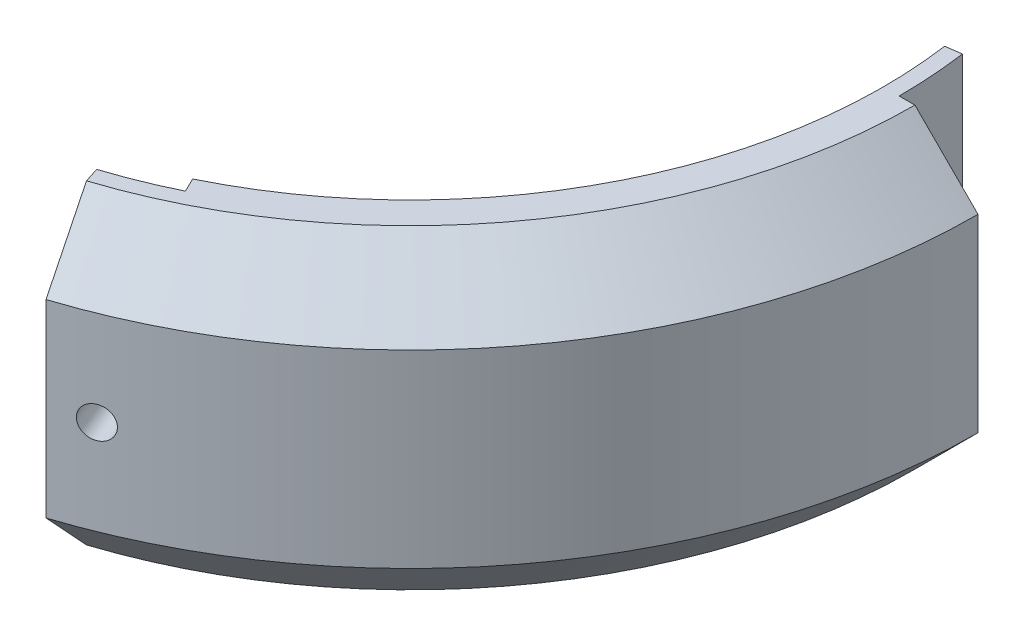
ISO-10303-21;
HEADER;
FILE_DESCRIPTION(('STEP AP214'),'2;1');
FILE_NAME('part.step','',(''),(''),'','','');
FILE_SCHEMA(('AUTOMOTIVE_DESIGN { 1 0 10303 214 1 1 1 1 }'));
ENDSEC;
DATA;
#1=APPLICATION_CONTEXT('core data for automotive mechanical design processes');
#2=APPLICATION_PROTOCOL_DEFINITION('international standard','automotive_design',2000,#1);
#3=PRODUCT_CONTEXT('',#1,'mechanical');
#4=PRODUCT('Part','Part','',(#3));
#5=PRODUCT_RELATED_PRODUCT_CATEGORY('part','',(#4));
#6=PRODUCT_DEFINITION_FORMATION('','',#4);
#7=PRODUCT_DEFINITION_CONTEXT('part definition',#1,'design');
#8=PRODUCT_DEFINITION('design','',#6,#7);
#9=PRODUCT_DEFINITION_SHAPE('','',#8);
#10=(LENGTH_UNIT() NAMED_UNIT(*) SI_UNIT(.MILLI.,.METRE.));
#11=(NAMED_UNIT(*) PLANE_ANGLE_UNIT() SI_UNIT($,.RADIAN.));
#12=(NAMED_UNIT(*) SI_UNIT($,.STERADIAN.) SOLID_ANGLE_UNIT());
#13=UNCERTAINTY_MEASURE_WITH_UNIT(LENGTH_MEASURE(1.E-05),#10,'distance_accuracy_value','');
#14=(GEOMETRIC_REPRESENTATION_CONTEXT(3) GLOBAL_UNCERTAINTY_ASSIGNED_CONTEXT((#13)) GLOBAL_UNIT_ASSIGNED_CONTEXT((#10,
#11,#12)) REPRESENTATION_CONTEXT('',''));
#15=CARTESIAN_POINT('',(0.,0.,0.));
#16=DIRECTION('',(0.,0.,1.));
#17=DIRECTION('',(1.,0.,0.));
#18=AXIS2_PLACEMENT_3D('',#15,#16,#17);
#19=CARTESIAN_POINT('',(0.,54.0309861928928,0.));
#20=DIRECTION('',(0.,1.,0.));
#21=DIRECTION('',(0.,0.,1.));
#22=AXIS2_PLACEMENT_3D('',#19,#20,#21);
#23=CYLINDRICAL_SURFACE('',#22,70.);
#24=DIRECTION('',(0.,1.,0.));
#25=VECTOR('',#24,1.);
#26=CARTESIAN_POINT('',(30.6859802752353,-25.,62.9155832409418));
#27=LINE('',#26,#25);
#28=CARTESIAN_POINT('',(30.6859802752353,-7.5,62.9155832409418));
#29=VERTEX_POINT('',#28);
#30=CARTESIAN_POINT('',(30.6859802752353,7.5,62.9155832409418));
#31=VERTEX_POINT('',#30);
#32=EDGE_CURVE('E168',#29,#31,#27,.T.);
#33=ORIENTED_EDGE('',*,*,#32,.T.);
#34=CARTESIAN_POINT('',(0.,7.5,0.));
#35=DIRECTION('',(0.,1.,0.));
#36=DIRECTION('',(0.,0.,1.));
#37=AXIS2_PLACEMENT_3D('',#34,#35,#36);
#38=CIRCLE('',#37,70.);
#39=CARTESIAN_POINT('',(69.3187648119099,7.5,-9.7421170672046));
#40=VERTEX_POINT('',#39);
#41=EDGE_CURVE('E275',#31,#40,#38,.T.);
#42=ORIENTED_EDGE('',*,*,#41,.T.);
#43=DIRECTION('',(0.,-1.,0.));
#44=VECTOR('',#43,1.);
#45=CARTESIAN_POINT('',(69.3187648119099,7.5,-9.7421170672046));
#46=LINE('',#45,#44);
#47=CARTESIAN_POINT('',(69.3187648119099,-7.5,-9.7421170672046));
#48=VERTEX_POINT('',#47);
#49=EDGE_CURVE('E233',#40,#48,#46,.T.);
#50=ORIENTED_EDGE('',*,*,#49,.T.);
#51=CARTESIAN_POINT('',(0.,-7.5,0.));
#52=DIRECTION('',(0.,1.,0.));
#53=DIRECTION('',(0.,0.,1.));
#54=AXIS2_PLACEMENT_3D('',#51,#52,#53);
#55=CIRCLE('',#54,70.);
#56=EDGE_CURVE('E278',#29,#48,#55,.T.);
#57=ORIENTED_EDGE('',*,*,#56,.F.);
#58=EDGE_LOOP('',(#33,#42,#50,#57));
#59=FACE_BOUND('',#58,.T.);
#60=CARTESIAN_POINT('',(69.9593263831697,0.,-2.38592791448767));
#61=CARTESIAN_POINT('',(69.959326550426,0.140378044259406,-2.38593415177356));
#62=CARTESIAN_POINT('',(69.9589248819653,0.280856736087863,-2.39779209793044));
#63=CARTESIAN_POINT('',(69.9572931642084,0.557941966835482,-2.44492695153471));
#64=CARTESIAN_POINT('',(69.9560621285396,0.694543693020799,-2.48023174378259));
#65=CARTESIAN_POINT('',(69.9527023788442,0.959820836298902,-2.57324369685586));
#66=CARTESIAN_POINT('',(69.9505741082575,1.08850013293342,-2.63093979012618));
#67=CARTESIAN_POINT('',(69.9453211083535,1.33430989113533,-2.76706924621994));
#68=CARTESIAN_POINT('',(69.9421966203571,1.45144314059838,-2.84549758613608));
#69=CARTESIAN_POINT('',(69.9348398411618,1.67094031065622,-3.02090426863462));
#70=CARTESIAN_POINT('',(69.9306069933707,1.77329677051745,-3.11789192466232));
#71=CARTESIAN_POINT('',(69.920940093781,1.96027173551395,-3.32763189793));
#72=CARTESIAN_POINT('',(69.9155059938863,2.04488953015974,-3.44038484631823));
#73=CARTESIAN_POINT('',(69.9033835326936,2.19400040929476,-3.67847261426926));
#74=CARTESIAN_POINT('',(69.8966948597617,2.25848848296921,-3.80381055632076));
#75=CARTESIAN_POINT('',(69.8820796457553,2.36547693738323,-4.06347599876575));
#76=CARTESIAN_POINT('',(69.8741531106762,2.40797742461368,-4.19780345561742));
#77=CARTESIAN_POINT('',(69.857167821694,2.46976676296927,-4.47156506274886));
#78=CARTESIAN_POINT('',(69.8481095564155,2.4890655934421,-4.61099699091565));
#79=CARTESIAN_POINT('',(69.8290574350643,2.50393455933073,-4.89105653631662));
#80=CARTESIAN_POINT('',(69.8190635835768,2.49950481103373,-5.03168414768771));
#81=CARTESIAN_POINT('',(69.7984424199141,2.46705073334547,-5.310076696771));
#82=CARTESIAN_POINT('',(69.7878153986748,2.43903716399264,-5.44784291061948));
#83=CARTESIAN_POINT('',(69.7663085533228,2.36022730355139,-5.71667624574899));
#84=CARTESIAN_POINT('',(69.7554287285355,2.3094309516504,-5.84774334914749));
#85=CARTESIAN_POINT('',(69.7338659000933,2.18648512043652,-6.09950252666526));
#86=CARTESIAN_POINT('',(69.7231829424338,2.11433071664268,-6.22019219979154));
#87=CARTESIAN_POINT('',(69.7025071210962,1.95072061799124,-6.44775752850294));
#88=CARTESIAN_POINT('',(69.6925142597695,1.85926485737246,-6.55463313702049));
#89=CARTESIAN_POINT('',(69.6737075923947,1.65958725365567,-6.75161376746318));
#90=CARTESIAN_POINT('',(69.6648944479481,1.55135607547707,-6.84170938993159));
#91=CARTESIAN_POINT('',(69.6489148103262,1.32123281660857,-7.00251503648843));
#92=CARTESIAN_POINT('',(69.6417483174533,1.19934073340952,-7.07322505701623));
#93=CARTESIAN_POINT('',(69.6294521482925,0.945350345305501,-7.19326437909211));
#94=CARTESIAN_POINT('',(69.6243225020767,0.813251889747584,-7.24259336497061));
#95=CARTESIAN_POINT('',(69.6163874695355,0.542600994389155,-7.31847413125912));
#96=CARTESIAN_POINT('',(69.6135820742646,0.404048579430221,-7.34502599933164));
#97=CARTESIAN_POINT('',(69.6104561531306,0.124504771162317,-7.37459286976123));
#98=CARTESIAN_POINT('',(69.6101342552323,-0.0164852323158466,-7.37762086814308));
#99=CARTESIAN_POINT('',(69.6119901379051,-0.296974054397864,-7.36008857032014));
#100=CARTESIAN_POINT('',(69.6141679143215,-0.43647287547979,-7.33952831332088));
#101=CARTESIAN_POINT('',(69.6208980391033,-0.709982966958439,-7.27540955692346));
#102=CARTESIAN_POINT('',(69.6254497765374,-0.843995639632643,-7.23185697449026));
#103=CARTESIAN_POINT('',(69.6366716125029,-1.10277239088705,-7.12298702499493));
#104=CARTESIAN_POINT('',(69.6433417171815,-1.22753644262814,-7.05766959477513));
#105=CARTESIAN_POINT('',(69.6584379453965,-1.46433449479363,-6.90707826619894));
#106=CARTESIAN_POINT('',(69.6668648394314,-1.57636287613935,-6.82179560940295));
#107=CARTESIAN_POINT('',(69.6850272353327,-1.78445304917113,-6.63369305505199));
#108=CARTESIAN_POINT('',(69.6947627417154,-1.88051478574829,-6.53087309696946));
#109=CARTESIAN_POINT('',(69.7150576027051,-2.05398848521842,-6.3105439400178));
#110=CARTESIAN_POINT('',(69.7256173266289,-2.13139202346875,-6.19302814184566));
#111=CARTESIAN_POINT('',(69.747060651571,-2.26529453507196,-5.94666285900773));
#112=CARTESIAN_POINT('',(69.757944251699,-2.32179356588254,-5.81781340549459));
#113=CARTESIAN_POINT('',(69.7795665003215,-2.41226848815667,-5.55245893679651));
#114=CARTESIAN_POINT('',(69.7903051832206,-2.44624982107733,-5.41595577980197));
#115=CARTESIAN_POINT('',(69.8112350801234,-2.49074257909727,-5.13913569790411));
#116=CARTESIAN_POINT('',(69.8214262952185,-2.50125405098419,-4.99881878060416));
#117=CARTESIAN_POINT('',(69.8409342845849,-2.4985080934889,-4.71843583591915));
#118=CARTESIAN_POINT('',(69.8502515433931,-2.48526391760666,-4.57836971225207));
#119=CARTESIAN_POINT('',(69.8677935631109,-2.43540992027922,-4.30238879239136));
#120=CARTESIAN_POINT('',(69.8760183218775,-2.39880005300248,-4.16647400434108));
#121=CARTESIAN_POINT('',(69.8912493792916,-2.30325608756317,-3.9026572593203));
#122=CARTESIAN_POINT('',(69.898255659435,-2.24432165041887,-3.7747554240548));
#123=CARTESIAN_POINT('',(69.9110132967545,-2.10580501261109,-3.53060657553858));
#124=CARTESIAN_POINT('',(69.9167646976851,-2.02622353207188,-3.41435915600303));
#125=CARTESIAN_POINT('',(69.9270516694599,-1.84862892844088,-3.19676963532564));
#126=CARTESIAN_POINT('',(69.931586690873,-1.75060751004133,-3.09543427916572));
#127=CARTESIAN_POINT('',(69.9395240428742,-1.53890331572833,-2.91059453549716));
#128=CARTESIAN_POINT('',(69.942926093141,-1.42521667372808,-2.82709456267103));
#129=CARTESIAN_POINT('',(69.9487059436541,-1.18535423338409,-2.68029012617918));
#130=CARTESIAN_POINT('',(69.9510830039567,-1.05916949316,-2.61700026077957));
#131=CARTESIAN_POINT('',(69.9549123252303,-0.798052647910152,-2.51256804944793));
#132=CARTESIAN_POINT('',(69.9563656869298,-0.663131166213629,-2.47139935183717));
#133=CARTESIAN_POINT('',(69.958045135244,-0.4394672014826,-2.42327070403676));
#134=CARTESIAN_POINT('',(69.9585265338674,-0.352175793305513,-2.40928494607034));
#135=CARTESIAN_POINT('',(69.9591671051461,-0.176602870327788,-2.39061159111026));
#136=CARTESIAN_POINT('',(69.9593262779375,-0.0883213559455261,-2.38592399018776));
#137=CARTESIAN_POINT('',(69.9593263831697,0.,-2.38592791448767));
#138=B_SPLINE_CURVE_WITH_KNOTS('',3,(#60,#61,#62,#63,#64,#65,#66,#67,#68,#69,#70,#71,#72,#73,
#74,#75,#76,#77,#78,#79,#80,#81,#82,#83,#84,#85,#86,#87,#88,#89,#90,#91,#92,#93,#94,#95,#96,#97,
#98,#99,#100,#101,#102,#103,#104,#105,#106,#107,#108,#109,#110,#111,#112,#113,#114,#115,#116,
#117,#118,#119,#120,#121,#122,#123,#124,#125,#126,#127,#128,#129,#130,#131,#132,#133,#134,#135,
#136,#137),.UNSPECIFIED.,.T.,.F.,(4,2,2,2,2,2,2,2,2,2,2,2,2,2,2,2,2,2,2,2,2,2,2,2,2,2,2,2,2,2,2,
2,2,2,2,2,2,2,4),(0.,0.420811743080999,0.842124846338541,1.26322996796266,1.68423315965435,
2.10544817605607,2.5266800602253,2.94801671657856,3.36935133228352,3.79050466133906,
4.2116559264407,4.63261514677333,5.05357549075088,5.47463297036998,5.89569188458703,
6.31698595390646,6.73828010060707,7.15958046708274,7.58087921208849,8.0019451893299,
8.42301046672782,8.84396743777483,9.2649256303738,9.68606883808779,10.1072134993481,
10.5285479632374,10.9498812690468,11.3711127214597,11.7923433341384,12.2133390113783,
12.6343355143989,13.0553384101899,13.4763266242829,13.8975046770929,14.3187868610091,
14.7403726628308,15.1614551339686,15.4262164764366,15.6909777070321),.UNSPECIFIED.);
#139=CARTESIAN_POINT('',(69.9593263831697,0.,-2.38592791448767));
#140=VERTEX_POINT('',#139);
#141=EDGE_CURVE('E310',#140,#140,#138,.T.);
#142=ORIENTED_EDGE('',*,*,#141,.F.);
#143=EDGE_LOOP('',(#142));
#144=FACE_BOUND('',#143,.T.);
#145=ADVANCED_FACE('F40',(#59,#144),#23,.F.);
#146=CARTESIAN_POINT('',(0.,-25.,0.));
#147=DIRECTION('',(0.,1.,0.));
#148=DIRECTION('',(0.,0.,1.));
#149=AXIS2_PLACEMENT_3D('',#146,#147,#148);
#150=CYLINDRICAL_SURFACE('',#149,77.5);
#151=DIRECTION('',(0.,1.,0.));
#152=VECTOR('',#151,1.);
#153=CARTESIAN_POINT('',(77.5,-25.,0.));
#154=LINE('',#153,#152);
#155=CARTESIAN_POINT('',(77.5,-25.,0.));
#156=VERTEX_POINT('',#155);
#157=CARTESIAN_POINT('',(77.5,25.,0.));
#158=VERTEX_POINT('',#157);
#159=EDGE_CURVE('E148',#156,#158,#154,.T.);
#160=ORIENTED_EDGE('',*,*,#159,.F.);
#161=CARTESIAN_POINT('',(0.,-25.,0.));
#162=DIRECTION('',(0.,1.,0.));
#163=DIRECTION('',(0.,0.,1.));
#164=AXIS2_PLACEMENT_3D('',#161,#162,#163);
#165=CIRCLE('',#164,77.5);
#166=CARTESIAN_POINT('',(76.7457753274717,-25.,-10.7859153244051));
#167=VERTEX_POINT('',#166);
#168=EDGE_CURVE('E71',#156,#167,#165,.T.);
#169=ORIENTED_EDGE('',*,*,#168,.T.);
#170=DIRECTION('',(0.,1.,0.));
#171=VECTOR('',#170,1.);
#172=CARTESIAN_POINT('',(76.7457753274717,-25.,-10.7859153244051));
#173=LINE('',#172,#171);
#174=CARTESIAN_POINT('',(76.7457753274717,25.,-10.7859153244051));
#175=VERTEX_POINT('',#174);
#176=EDGE_CURVE('E163',#167,#175,#173,.T.);
#177=ORIENTED_EDGE('',*,*,#176,.T.);
#178=CARTESIAN_POINT('',(0.,25.,0.));
#179=DIRECTION('',(0.,1.,0.));
#180=DIRECTION('',(0.,0.,1.));
#181=AXIS2_PLACEMENT_3D('',#178,#179,#180);
#182=CIRCLE('',#181,77.5);
#183=EDGE_CURVE('E160',#158,#175,#182,.T.);
#184=ORIENTED_EDGE('',*,*,#183,.F.);
#185=EDGE_LOOP('',(#160,#169,#177,#184));
#186=FACE_BOUND('',#185,.T.);
#187=CARTESIAN_POINT('',(77.4453702529907,0.,-2.90940309637351));
#188=CARTESIAN_POINT('',(77.44537036223,0.140386896102214,-2.90940933276516));
#189=CARTESIAN_POINT('',(77.4449274208994,0.280874656140934,-2.921265885909));
#190=CARTESIAN_POINT('',(77.4431350164643,0.557978380898638,-2.96839577972018));
#191=CARTESIAN_POINT('',(77.4417844717835,0.69458952324232,-3.00369705849955));
#192=CARTESIAN_POINT('',(77.4381210636492,0.959885547095167,-3.09670139955933));
#193=CARTESIAN_POINT('',(77.4358086726694,1.08857428462997,-3.15439346221393));
#194=CARTESIAN_POINT('',(77.4301435100699,1.33440105343723,-3.29051573396913));
#195=CARTESIAN_POINT('',(77.4267909916464,1.45154188665813,-3.36894089536632));
#196=CARTESIAN_POINT('',(77.4189599763052,1.67104275219641,-3.5443367030454));
#197=CARTESIAN_POINT('',(77.414480996137,1.77339641108803,-3.64131530444561));
#198=CARTESIAN_POINT('',(77.4043313354422,1.96036374200774,-3.85103734720959));
#199=CARTESIAN_POINT('',(77.3986606073736,2.04497670604119,-3.9637814174416));
#200=CARTESIAN_POINT('',(77.3861013159498,2.19407206410734,-4.20184631911576));
#201=CARTESIAN_POINT('',(77.3792125099455,2.25855044010771,-4.3271696542744));
#202=CARTESIAN_POINT('',(77.3642559305798,2.36552023855836,-4.58680673116331));
#203=CARTESIAN_POINT('',(77.3561881623129,2.40801175601615,-4.72112043404244));
#204=CARTESIAN_POINT('',(77.3389945998533,2.46978742155111,-4.99486794540066));
#205=CARTESIAN_POINT('',(77.3298691777333,2.48907970389647,-5.13429994158872));
#206=CARTESIAN_POINT('',(77.3107648442457,2.50393432807648,-5.41436392074262));
#207=CARTESIAN_POINT('',(77.3007859365743,2.49949677267251,-5.55499589850934));
#208=CARTESIAN_POINT('',(77.2802741145048,2.46702453766643,-5.83341371315848));
#209=CARTESIAN_POINT('',(77.2697414075528,2.43899863574046,-5.97120058922001));
#210=CARTESIAN_POINT('',(77.2484927088292,2.36015884258222,-6.2400780316841));
#211=CARTESIAN_POINT('',(77.2377767166226,2.30934489724892,-6.37116858218811));
#212=CARTESIAN_POINT('',(77.2165931718771,2.18636137736616,-6.62296941747174));
#213=CARTESIAN_POINT('',(77.20612566651,2.11418778245581,-6.7436777425605));
#214=CARTESIAN_POINT('',(77.1859077597756,1.95053669217787,-6.97127812710442));
#215=CARTESIAN_POINT('',(77.1761573603484,1.85905914458625,-7.07817014918033));
#216=CARTESIAN_POINT('',(77.1578365778376,1.65934718273147,-7.2751679681983));
#217=CARTESIAN_POINT('',(77.1492667344506,1.55110515222581,-7.36526609433621));
#218=CARTESIAN_POINT('',(77.1337460153238,1.32096367835869,-7.52607289424791));
#219=CARTESIAN_POINT('',(77.1267951398616,1.19906423265587,-7.59678156469766));
#220=CARTESIAN_POINT('',(77.1148782620334,0.945063867272257,-7.71681325113766));
#221=CARTESIAN_POINT('',(77.1099122830324,0.812962827525994,-7.76613601538588));
#222=CARTESIAN_POINT('',(77.10223411798,0.542311126138941,-7.84199976122125));
#223=CARTESIAN_POINT('',(77.0995219248371,0.403760484793119,-7.86854081449054));
#224=CARTESIAN_POINT('',(77.0965012466364,0.124209449797037,-7.89808336755831));
#225=CARTESIAN_POINT('',(77.0961916786359,-0.0167898114534679,-7.90109547263539));
#226=CARTESIAN_POINT('',(77.0979905219835,-0.297294382195192,-7.88352284751544));
#227=CARTESIAN_POINT('',(77.1000989300741,-0.436799693698759,-7.86293814910731));
#228=CARTESIAN_POINT('',(77.1066168012898,-0.71032655493914,-7.79876109940765));
#229=CARTESIAN_POINT('',(77.1110257820297,-0.844349247923779,-7.7551735713402));
#230=CARTESIAN_POINT('',(77.1219049435849,-1.10314155598354,-7.6462250603809));
#231=CARTESIAN_POINT('',(77.1283751292345,-1.22791114935586,-7.58086402642208));
#232=CARTESIAN_POINT('',(77.1430363353185,-1.46470456807067,-7.43018539457835));
#233=CARTESIAN_POINT('',(77.1512279720901,-1.57672380615384,-7.34486064777143));
#234=CARTESIAN_POINT('',(77.1689116435078,-1.78479060926658,-7.15667406543826));
#235=CARTESIAN_POINT('',(77.1784036819107,-1.88083812815463,-7.05381217924983));
#236=CARTESIAN_POINT('',(77.1982299061547,-2.05427062638837,-6.83341223748384));
#237=CARTESIAN_POINT('',(77.2085644002299,-2.13164873367917,-6.71586880183872));
#238=CARTESIAN_POINT('',(77.2296017863641,-2.26549893959274,-6.469457319605));
#239=CARTESIAN_POINT('',(77.2403046775247,-2.32197108919414,-6.34058930063207));
#240=CARTESIAN_POINT('',(77.261630945429,-2.41239429180301,-6.07520260996008));
#241=CARTESIAN_POINT('',(77.2722543374646,-2.44634979207087,-5.93868545482101));
#242=CARTESIAN_POINT('',(77.2930316152259,-2.49079040673497,-5.66184808307405));
#243=CARTESIAN_POINT('',(77.3031855015593,-2.50127555150331,-5.52152787138779));
#244=CARTESIAN_POINT('',(77.3227020745872,-2.49847731385191,-5.24113403412554));
#245=CARTESIAN_POINT('',(77.3320651194508,-2.48520475231093,-5.10106032536079));
#246=CARTESIAN_POINT('',(77.3497756153684,-2.43529012993247,-4.82507421376923));
#247=CARTESIAN_POINT('',(77.3581230644186,-2.39864802298612,-4.68916181915338));
#248=CARTESIAN_POINT('',(77.3736626272502,-2.30303606711253,-4.42535937880162));
#249=CARTESIAN_POINT('',(77.3808547223344,-2.24406585689997,-4.29746946291442));
#250=CARTESIAN_POINT('',(77.394026143599,-2.10547499331861,-4.05335402614142));
#251=CARTESIAN_POINT('',(77.4000055130403,-2.02585507680481,-3.93712808924856));
#252=CARTESIAN_POINT('',(77.4107644171025,-1.84819163739616,-3.71960186903178));
#253=CARTESIAN_POINT('',(77.4155435325342,-1.75014169865189,-3.61830680541127));
#254=CARTESIAN_POINT('',(77.4239581696927,-1.53838468568991,-3.43355200066631));
#255=CARTESIAN_POINT('',(77.4275934081165,-1.42467374273518,-3.35009667953323));
#256=CARTESIAN_POINT('',(77.4338022113701,-1.18477414046503,-3.20338688357239));
#257=CARTESIAN_POINT('',(77.4363750574282,-1.05857710488655,-3.14014609159372));
#258=CARTESIAN_POINT('',(77.4405360010762,-0.797443607595875,-3.03580898239044));
#259=CARTESIAN_POINT('',(77.442125272319,-0.662517774815167,-2.9946862804102));
#260=CARTESIAN_POINT('',(77.4439641325333,-0.438950707462365,-2.94664856824325));
#261=CARTESIAN_POINT('',(77.4444921453646,-0.351760348294769,-2.93269920983707));
#262=CARTESIAN_POINT('',(77.4451951712108,-0.176393268354732,-2.91407451607319));
#263=CARTESIAN_POINT('',(77.4453701843467,-0.0882165479200912,-2.90939917753951));
#264=CARTESIAN_POINT('',(77.4453702529907,0.,-2.90940309637351));
#265=B_SPLINE_CURVE_WITH_KNOTS('',3,(#187,#188,#189,#190,#191,#192,#193,#194,#195,#196,#197,
#198,#199,#200,#201,#202,#203,#204,#205,#206,#207,#208,#209,#210,#211,#212,#213,#214,#215,#216,
#217,#218,#219,#220,#221,#222,#223,#224,#225,#226,#227,#228,#229,#230,#231,#232,#233,#234,#235,
#236,#237,#238,#239,#240,#241,#242,#243,#244,#245,#246,#247,#248,#249,#250,#251,#252,#253,#254,
#255,#256,#257,#258,#259,#260,#261,#262,#263,#264),.UNSPECIFIED.,.T.,.F.,(4,2,2,2,2,2,2,2,2,2,2,
2,2,2,2,2,2,2,2,2,2,2,2,2,2,2,2,2,2,2,2,2,2,2,2,2,2,2,4),(0.,0.420838684383421,
0.842179766861852,1.26331412411443,1.68434604579612,2.10555889865818,2.52678855806067,
2.94810222386862,3.36941406912099,3.79057814813368,4.21174040330895,4.63274600518691,
5.05375260657846,5.47483850122474,5.89592553507224,6.31720443643065,6.73848341001129,
7.15976734250004,7.58104994942379,8.00214265931849,8.4232348019305,8.84423868517168,
9.26524355583061,9.68639941793551,10.1075564967178,10.5288683642108,10.9501792043391,
11.3714068066153,11.7926338637964,12.2136691142809,12.634705195484,13.0557480896555,
13.4767759615847,13.8979506738743,14.3192296161696,14.7407931136576,15.1618526047454,
15.4262999977151,15.6907473001222),.UNSPECIFIED.);
#266=CARTESIAN_POINT('',(77.4453702529907,0.,-2.90940309637351));
#267=VERTEX_POINT('',#266);
#268=EDGE_CURVE('E44',#267,#267,#265,.T.);
#269=ORIENTED_EDGE('',*,*,#268,.T.);
#270=EDGE_LOOP('',(#269));
#271=FACE_BOUND('',#270,.T.);
#272=ADVANCED_FACE('F161',(#186,#271),#150,.T.);
#273=CARTESIAN_POINT('',(0.,54.0309861928928,0.));
#274=DIRECTION('',(0.,1.,0.));
#275=DIRECTION('',(0.,0.,1.));
#276=AXIS2_PLACEMENT_3D('',#273,#274,#275);
#277=CYLINDRICAL_SURFACE('',#276,90.);
#278=CARTESIAN_POINT('',(0.,-15.,0.));
#279=DIRECTION('',(0.,1.,0.));
#280=DIRECTION('',(0.,0.,1.));
#281=AXIS2_PLACEMENT_3D('',#278,#279,#280);
#282=CIRCLE('',#281,90.);
#283=CARTESIAN_POINT('',(27.811529493745,-15.,85.5950864665639));
#284=VERTEX_POINT('',#283);
#285=CARTESIAN_POINT('',(90.,-15.,0.));
#286=VERTEX_POINT('',#285);
#287=EDGE_CURVE('E291',#284,#286,#282,.T.);
#288=ORIENTED_EDGE('',*,*,#287,.T.);
#289=DIRECTION('',(0.,1.,0.));
#290=VECTOR('',#289,1.);
#291=CARTESIAN_POINT('',(90.,-25.,0.));
#292=LINE('',#291,#290);
#293=CARTESIAN_POINT('',(90.,15.,0.));
#294=VERTEX_POINT('',#293);
#295=EDGE_CURVE('E157',#286,#294,#292,.T.);
#296=ORIENTED_EDGE('',*,*,#295,.T.);
#297=CARTESIAN_POINT('',(0.,15.,0.));
#298=DIRECTION('',(0.,1.,0.));
#299=DIRECTION('',(0.,0.,1.));
#300=AXIS2_PLACEMENT_3D('',#297,#298,#299);
#301=CIRCLE('',#300,90.);
#302=CARTESIAN_POINT('',(27.811529493745,15.,85.5950864665639));
#303=VERTEX_POINT('',#302);
#304=EDGE_CURVE('E295',#303,#294,#301,.T.);
#305=ORIENTED_EDGE('',*,*,#304,.F.);
#306=DIRECTION('',(0.,1.,0.));
#307=VECTOR('',#306,1.);
#308=CARTESIAN_POINT('',(27.811529493745,15.,85.5950864665639));
#309=LINE('',#308,#307);
#310=EDGE_CURVE('E263',#284,#303,#309,.T.);
#311=ORIENTED_EDGE('',*,*,#310,.F.);
#312=EDGE_LOOP('',(#288,#296,#305,#311));
#313=FACE_BOUND('',#312,.T.);
#314=CARTESIAN_POINT('',(31.3836240875641,0.,84.3508632980746));
#315=CARTESIAN_POINT('',(31.3836300276001,-0.140397030234249,84.3508614037102));
#316=CARTESIAN_POINT('',(31.3947509435403,-0.280895172113522,84.3467260231215));
#317=CARTESIAN_POINT('',(31.4389488877238,-0.558020069884317,84.3302616356892));
#318=CARTESIAN_POINT('',(31.472052171378,-0.694641992361816,84.3179228307774));
#319=CARTESIAN_POINT('',(31.5592395547899,-0.959959631646382,84.2853282154057));
#320=CARTESIAN_POINT('',(31.6133134251579,-1.08865917755253,84.2650762649184));
#321=CARTESIAN_POINT('',(31.7408457477325,-1.33450542026713,84.2171201699266));
#322=CARTESIAN_POINT('',(31.8142994553633,-1.45165493512669,84.1894178493911));
#323=CARTESIAN_POINT('',(31.9784843588244,-1.6711600281202,84.1271907583789));
#324=CARTESIAN_POINT('',(32.0692215185269,-1.77351047814285,84.0926636327619));
#325=CARTESIAN_POINT('',(32.265324938644,-1.9604690650959,84.0176160415272));
#326=CARTESIAN_POINT('',(32.370691780198,-2.04507649687948,83.9770953378206));
#327=CARTESIAN_POINT('',(32.593019735959,-2.19415408514549,83.8910558584073));
#328=CARTESIAN_POINT('',(32.7099825062234,-2.25862135986432,83.8455363687052));
#329=CARTESIAN_POINT('',(32.9521192093744,-2.36556980234931,83.7506700271869));
#330=CARTESIAN_POINT('',(33.0772931116844,-2.40805105198163,83.7013231896228));
#331=CARTESIAN_POINT('',(33.3322285665309,-2.46981106609731,83.6001275825603));
#332=CARTESIAN_POINT('',(33.4619889195456,-2.48909585174001,83.5482794659607));
#333=CARTESIAN_POINT('',(33.7224255352597,-2.50393405465755,83.4435001352073));
#334=CARTESIAN_POINT('',(33.8531017945893,-2.49948755919938,83.3905689250371));
#335=CARTESIAN_POINT('',(34.1116269604994,-2.46699452819021,83.2851510981432));
#336=CARTESIAN_POINT('',(34.2394766367095,-2.43895450003326,83.2326643628591));
#337=CARTESIAN_POINT('',(34.4887823641839,-2.36008041948384,83.1296703608051));
#338=CARTESIAN_POINT('',(34.6102384024363,-2.30924632070443,83.0791630980637));
#339=CARTESIAN_POINT('',(34.843370461984,-2.1862196336018,82.981657734888));
#340=CARTESIAN_POINT('',(34.9550451145939,-2.11402406238815,82.9346601256862));
#341=CARTESIAN_POINT('',(35.1654845669879,-1.95032603456317,82.8456502769203));
#342=CARTESIAN_POINT('',(35.2642493422204,-1.8588235412354,82.8036380468373));
#343=CARTESIAN_POINT('',(35.4461621111227,-1.65907224966145,82.725929439205));
#344=CARTESIAN_POINT('',(35.5293048165245,-1.55081780320032,82.6902352006117));
#345=CARTESIAN_POINT('',(35.6776344451399,-1.3206554967511,82.6263453380797));
#346=CARTESIAN_POINT('',(35.742821365502,-1.19874763459485,82.5981497153317));
#347=CARTESIAN_POINT('',(35.8534428797058,-0.944735855122515,82.5501925292415));
#348=CARTESIAN_POINT('',(35.898877305805,-0.812631851229746,82.5304310375238));
#349=CARTESIAN_POINT('',(35.968741933271,-0.541979213740722,82.5000064730621));
#350=CARTESIAN_POINT('',(35.9931721838587,-0.403430595247487,82.489343378997));
#351=CARTESIAN_POINT('',(36.0203518021683,-0.123871267323419,82.4774786280677));
#352=CARTESIAN_POINT('',(36.023108414221,0.0171386036478838,82.4762738098111));
#353=CARTESIAN_POINT('',(36.0068840494808,0.297661225606959,82.4833581784712));
#354=CARTESIAN_POINT('',(35.9879030941404,0.43717397807208,82.4916473560184));
#355=CARTESIAN_POINT('',(35.9287302161377,0.710720039268184,82.5174367979105));
#356=CARTESIAN_POINT('',(35.8885415859466,0.844754195066796,82.5349356324639));
#357=CARTESIAN_POINT('',(35.7880605623568,1.10356429216026,82.5785547446074));
#358=CARTESIAN_POINT('',(35.7277681346387,1.22834021764979,82.6046750369152));
#359=CARTESIAN_POINT('',(35.5887207462979,1.46512829414481,82.6646760651087));
#360=CARTESIAN_POINT('',(35.5099608789259,1.57713704117038,82.6985588634165));
#361=CARTESIAN_POINT('',(35.336161070349,1.78517704334678,82.772970424146));
#362=CARTESIAN_POINT('',(35.2411210925858,1.88120826261793,82.8134992014918));
#363=CARTESIAN_POINT('',(35.0373653809191,2.05459356254799,82.8999110554382));
#364=CARTESIAN_POINT('',(34.9286459282244,2.13194254764887,82.9457955877646));
#365=CARTESIAN_POINT('',(34.7005787419226,2.26573285973333,83.0414661880747));
#366=CARTESIAN_POINT('',(34.5812310304491,2.32217423025647,83.0912522479333));
#367=CARTESIAN_POINT('',(34.3352670393833,2.4125382219839,83.1931916841299));
#368=CARTESIAN_POINT('',(34.2086518296599,2.44646414855955,83.2453447117845));
#369=CARTESIAN_POINT('',(33.9517031026652,2.49084506453879,83.3504716087349));
#370=CARTESIAN_POINT('',(33.8213695872287,2.50130006552398,83.4034454776258));
#371=CARTESIAN_POINT('',(33.5607220319691,2.49844195639296,83.5086683099117));
#372=CARTESIAN_POINT('',(33.4304080004624,2.48513688189092,83.5609175123653));
#373=CARTESIAN_POINT('',(33.173466210078,2.43515281452841,83.663255202429));
#374=CARTESIAN_POINT('',(33.0468384585178,2.39847377527304,83.71334368575));
#375=CARTESIAN_POINT('',(32.800891963971,2.30278393805766,83.8100170679304));
#376=CARTESIAN_POINT('',(32.6815733461624,2.243772757756,83.8566019067886));
#377=CARTESIAN_POINT('',(32.4536825664263,2.1050968906252,83.9450620814175));
#378=CARTESIAN_POINT('',(32.3451100113127,2.0254329598427,83.986937589505));
#379=CARTESIAN_POINT('',(32.1418179660376,1.8476907185085,84.0649476128201));
#380=CARTESIAN_POINT('',(32.0471016914776,1.74960814559832,84.1010807956042));
#381=CARTESIAN_POINT('',(31.8742783553619,1.53779071001759,84.1667330397288));
#382=CARTESIAN_POINT('',(31.7961754145237,1.4240519755393,84.1962504602141));
#383=CARTESIAN_POINT('',(31.6588439666813,1.18410986990224,84.2479851649793));
#384=CARTESIAN_POINT('',(31.5996272659253,1.0578987662728,84.2701978831808));
#385=CARTESIAN_POINT('',(31.5019222400262,0.796746220880312,84.3067710362051));
#386=CARTESIAN_POINT('',(31.463409178155,0.661815414428175,84.3211408420626));
#387=CARTESIAN_POINT('',(31.4184551395743,0.438359320212585,84.3378977272109));
#388=CARTESIAN_POINT('',(31.4054103555457,0.351284669862348,84.3427548057064));
#389=CARTESIAN_POINT('',(31.3879929670019,0.176153283177008,84.3492381850705));
#390=CARTESIAN_POINT('',(31.3836203603011,0.0880965470894276,84.3508644867533));
#391=CARTESIAN_POINT('',(31.3836240875641,0.,84.3508632980746));
#392=B_SPLINE_CURVE_WITH_KNOTS('',3,(#314,#315,#316,#317,#318,#319,#320,#321,#322,#323,#324,
#325,#326,#327,#328,#329,#330,#331,#332,#333,#334,#335,#336,#337,#338,#339,#340,#341,#342,#343,
#344,#345,#346,#347,#348,#349,#350,#351,#352,#353,#354,#355,#356,#357,#358,#359,#360,#361,#362,
#363,#364,#365,#366,#367,#368,#369,#370,#371,#372,#373,#374,#375,#376,#377,#378,#379,#380,#381,
#382,#383,#384,#385,#386,#387,#388,#389,#390,#391),.UNSPECIFIED.,.T.,.F.,(4,2,2,2,2,2,2,2,2,2,2,
2,2,2,2,2,2,2,2,2,2,2,2,2,2,2,2,2,2,2,2,2,2,2,2,2,2,2,4),(0.,0.420869528420549,
0.842242643418788,1.26341047188127,1.68447528547127,2.1056856568369,2.52691276486391,
2.94820011678904,3.36948590001648,3.79066230551224,4.21183716221797,4.63289589164723,
5.05395547795385,5.47507388828749,5.89619309947926,6.31745460902193,6.73871618546093,
7.15998133927661,7.58124550590271,8.00236886060167,8.42349179969985,8.84454937909153,
9.26560767728096,9.68677797655995,10.1079492216209,10.5292352112644,10.950520323586,
11.3717435756151,11.7929666197938,12.2140472340857,12.6351286841816,13.0562173438082,
13.4772905905858,13.8984614005714,14.3197365549035,14.7412745447452,15.1623077548147,
15.4263956882404,15.6904835551072),.UNSPECIFIED.);
#393=CARTESIAN_POINT('',(31.3836240875641,0.,84.3508632980746));
#394=VERTEX_POINT('',#393);
#395=EDGE_CURVE('E193',#394,#394,#392,.T.);
#396=ORIENTED_EDGE('',*,*,#395,.F.);
#397=EDGE_LOOP('',(#396));
#398=FACE_BOUND('',#397,.T.);
#399=ADVANCED_FACE('F335',(#313,#398),#277,.T.);
#400=CARTESIAN_POINT('',(0.,-25.,0.));
#401=DIRECTION('',(0.,1.,0.));
#402=DIRECTION('',(0.,0.,1.));
#403=AXIS2_PLACEMENT_3D('',#400,#401,#402);
#404=CYLINDRICAL_SURFACE('',#403,77.5);
#405=DIRECTION('',(0.,1.,0.));
#406=VECTOR('',#405,1.);
#407=CARTESIAN_POINT('',(33.9737638761533,-25.,69.6565385881855));
#408=LINE('',#407,#406);
#409=CARTESIAN_POINT('',(33.9737638761533,-25.,69.6565385881855));
#410=VERTEX_POINT('',#409);
#411=CARTESIAN_POINT('',(33.9737638761533,25.,69.6565385881855));
#412=VERTEX_POINT('',#411);
#413=EDGE_CURVE('E206',#410,#412,#408,.T.);
#414=ORIENTED_EDGE('',*,*,#413,.F.);
#415=CARTESIAN_POINT('',(0.,-25.,0.));
#416=DIRECTION('',(0.,1.,0.));
#417=DIRECTION('',(0.,0.,1.));
#418=AXIS2_PLACEMENT_3D('',#415,#416,#417);
#419=CIRCLE('',#418,77.5);
#420=CARTESIAN_POINT('',(23.9488170640582,-25.,73.7068800128745));
#421=VERTEX_POINT('',#420);
#422=EDGE_CURVE('E63',#421,#410,#419,.T.);
#423=ORIENTED_EDGE('',*,*,#422,.F.);
#424=DIRECTION('',(0.,1.,0.));
#425=VECTOR('',#424,1.);
#426=CARTESIAN_POINT('',(23.9488170640562,-25.,73.7068800128745));
#427=LINE('',#426,#425);
#428=CARTESIAN_POINT('',(23.9488170640562,25.,73.7068800128745));
#429=VERTEX_POINT('',#428);
#430=EDGE_CURVE('E202',#421,#429,#427,.T.);
#431=ORIENTED_EDGE('',*,*,#430,.T.);
#432=CARTESIAN_POINT('',(0.,25.,0.));
#433=DIRECTION('',(0.,1.,0.));
#434=DIRECTION('',(0.,0.,1.));
#435=AXIS2_PLACEMENT_3D('',#432,#433,#434);
#436=CIRCLE('',#435,77.5);
#437=EDGE_CURVE('E188',#429,#412,#436,.T.);
#438=ORIENTED_EDGE('',*,*,#437,.T.);
#439=EDGE_LOOP('',(#414,#423,#431,#438));
#440=FACE_BOUND('',#439,.T.);
#441=CARTESIAN_POINT('',(26.6989423171693,0.,72.7558690357312));
#442=CARTESIAN_POINT('',(26.698948282087,0.140386896102214,72.7558672124729));
#443=CARTESIAN_POINT('',(26.7100876578166,0.280874656140934,72.751782073818));
#444=CARTESIAN_POINT('',(26.7543569670067,0.557978380898638,72.7355134577694));
#445=CARTESIAN_POINT('',(26.7875131369654,0.69458952324232,72.7233203183842));
#446=CARTESIAN_POINT('',(26.8748334662032,0.959885547095167,72.6910962882681));
#447=CARTESIAN_POINT('',(26.928987310219,1.08857428462997,72.6710692459577));
#448=CARTESIAN_POINT('',(27.0566966522655,1.33440105343723,72.6236172608663));
#449=CARTESIAN_POINT('',(27.130247427887,1.45154188665814,72.5961941187153));
#450=CARTESIAN_POINT('',(27.2946388368874,1.67104275219641,72.534546095231));
#451=CARTESIAN_POINT('',(27.3854868867008,1.77339641108803,72.5003182960322));
#452=CARTESIAN_POINT('',(27.5818079844404,1.96036374200774,72.4258577197812));
#453=CARTESIAN_POINT('',(27.6872816157645,2.04497670604119,72.3856247031827));
#454=CARTESIAN_POINT('',(27.9098137573156,2.19407206410733,72.3001140068525));
#455=CARTESIAN_POINT('',(28.0268745737358,2.25855044010771,72.2548353226569));
#456=CARTESIAN_POINT('',(28.2691822703811,2.36552023855836,72.1603785012611));
#457=CARTESIAN_POINT('',(28.3944291152309,2.40801175601615,72.1112003809118));
#458=CARTESIAN_POINT('',(28.6494653667338,2.46978742155111,72.0102556981188));
#459=CARTESIAN_POINT('',(28.7792531647726,2.48907970389647,71.9584900495659));
#460=CARTESIAN_POINT('',(29.0397062734126,2.50393432807648,71.8537762196422));
#461=CARTESIAN_POINT('',(29.1703715802114,2.49949677267251,71.8008280433933));
#462=CARTESIAN_POINT('',(29.428824155481,2.46702453766643,71.6952843050897));
#463=CARTESIAN_POINT('',(29.5566124763744,2.43899863574046,71.642688619204));
#464=CARTESIAN_POINT('',(29.8057639111007,2.36015884258222,71.5393922066946));
#465=CARTESIAN_POINT('',(29.9271270096788,2.30934489724891,71.4886914845702));
#466=CARTESIAN_POINT('',(30.1600577595564,2.18636137736616,71.3907339990013));
#467=CARTESIAN_POINT('',(30.271623561656,2.11418778245581,71.3434778859977));
#468=CARTESIAN_POINT('',(30.4818367137161,1.95053669217787,71.2539171273017));
#469=CARTESIAN_POINT('',(30.5804840287264,1.85905914458625,71.2116124950054));
#470=CARTESIAN_POINT('',(30.7621786550533,1.65934718273147,71.1333127214836));
#471=CARTESIAN_POINT('',(30.845218837777,1.55110515222581,71.0973204639487));
#472=CARTESIAN_POINT('',(30.9933590267225,1.32096367835869,71.0328673489019));
#473=CARTESIAN_POINT('',(31.0584590298688,1.19906423265587,71.004406492681));
#474=CARTESIAN_POINT('',(31.1689334296506,0.945063867272254,70.9559810373951));
#475=CARTESIAN_POINT('',(31.2143075940855,0.812962827525991,70.9360165383442));
#476=CARTESIAN_POINT('',(31.284085620426,0.542311126138939,70.9052709827178));
#477=CARTESIAN_POINT('',(31.3084895483139,0.403760484793117,70.894489897247));
#478=CARTESIAN_POINT('',(31.3356527450185,0.124209449797036,70.8824879106054));
#479=CARTESIAN_POINT('',(31.3384217654067,-0.016789811453469,70.8812627022837));
#480=CARTESIAN_POINT('',(31.3222650789426,-0.297294382195193,70.888403743769));
#481=CARTESIAN_POINT('',(31.3033394013166,-0.43679969369876,70.8967699806548));
#482=CARTESIAN_POINT('',(31.244317532976,-0.71032655493914,70.9228006435529));
#483=CARTESIAN_POINT('',(31.2042257803547,-0.84434924792378,70.9404631203314));
#484=CARTESIAN_POINT('',(31.1039714348714,-1.10314155598354,70.9844767592186));
#485=CARTESIAN_POINT('',(31.0438087949355,-1.22791114935586,71.0108279417055));
#486=CARTESIAN_POINT('',(30.9050354620921,-1.46470456807067,71.0713338352173));
#487=CARTESIAN_POINT('',(30.8264181606143,-1.57672380615384,71.1054913415521));
#488=CARTESIAN_POINT('',(30.6529066401981,-1.78479060926658,71.1804623645403));
#489=CARTESIAN_POINT('',(30.5580123742379,-1.88083812815463,71.2212759004219));
#490=CARTESIAN_POINT('',(30.354526213656,-2.05427062638837,71.3082390877476));
#491=CARTESIAN_POINT('',(30.2459292975354,-2.13164873367916,71.354390694872));
#492=CARTESIAN_POINT('',(30.0180789614998,-2.26549893959274,71.4505437736601));
#493=CARTESIAN_POINT('',(29.8988255675711,-2.32197108919414,71.5005452359357));
#494=CARTESIAN_POINT('',(29.6530180052786,-2.412394291803,71.602836719493));
#495=CARTESIAN_POINT('',(29.5264652839744,-2.44634979207086,71.6551262866752));
#496=CARTESIAN_POINT('',(29.2695978295455,-2.49079040673497,71.7604341046289));
#497=CARTESIAN_POINT('',(29.1392831012893,-2.50127555150331,71.8134523544574));
#498=CARTESIAN_POINT('',(28.8786436679696,-2.49847731385191,71.9186601792433));
#499=CARTESIAN_POINT('',(28.7483189944692,-2.48520475231093,71.9708501205466));
#500=CARTESIAN_POINT('',(28.4913134488505,-2.43529012993247,72.0729782017892));
#501=CARTESIAN_POINT('',(28.364632583922,-2.39864802298612,72.1229163372853));
#502=CARTESIAN_POINT('',(28.118543543011,-2.30303606711253,72.2192147770029));
#503=CARTESIAN_POINT('',(27.9991354847442,-2.24406585689997,72.2655750233169));
#504=CARTESIAN_POINT('',(27.7710381008839,-2.10547499331861,72.3535376078916));
#505=CARTESIAN_POINT('',(27.6623483930124,-2.0258550768048,72.3951401158491));
#506=CARTESIAN_POINT('',(27.4587933480062,-1.84819163739616,72.4725917404348));
#507=CARTESIAN_POINT('',(27.3639328455679,-1.75014169865189,72.5084388454132));
#508=CARTESIAN_POINT('',(27.1908208504818,-1.5383846856899,72.5735340153737));
#509=CARTESIAN_POINT('',(27.1125734739503,-1.42467374273518,72.6027804450661));
#510=CARTESIAN_POINT('',(26.9749627922175,-1.18477414046503,72.6540211880521));
#511=CARTESIAN_POINT('',(26.9156122780664,-1.05857710488655,72.6760105895201));
#512=CARTESIAN_POINT('',(26.817667592767,-0.797443607595875,72.7122098219782));
#513=CARTESIAN_POINT('',(26.7790486909038,-0.662517774815167,72.7264289225164));
#514=CARTESIAN_POINT('',(26.733930350776,-0.438950707462365,72.7430222519363));
#515=CARTESIAN_POINT('',(26.7208268875038,-0.351760348294769,72.7478350107882));
#516=CARTESIAN_POINT('',(26.7033309980696,-0.176393268354732,72.7542589749885));
#517=CARTESIAN_POINT('',(26.6989385689245,-0.0882165479200911,72.7558701814332));
#518=CARTESIAN_POINT('',(26.6989423171693,0.,72.7558690357312));
#519=B_SPLINE_CURVE_WITH_KNOTS('',3,(#441,#442,#443,#444,#445,#446,#447,#448,#449,#450,#451,
#452,#453,#454,#455,#456,#457,#458,#459,#460,#461,#462,#463,#464,#465,#466,#467,#468,#469,#470,
#471,#472,#473,#474,#475,#476,#477,#478,#479,#480,#481,#482,#483,#484,#485,#486,#487,#488,#489,
#490,#491,#492,#493,#494,#495,#496,#497,#498,#499,#500,#501,#502,#503,#504,#505,#506,#507,#508,
#509,#510,#511,#512,#513,#514,#515,#516,#517,#518),.UNSPECIFIED.,.T.,.F.,(4,2,2,2,2,2,2,2,2,2,2,
2,2,2,2,2,2,2,2,2,2,2,2,2,2,2,2,2,2,2,2,2,2,2,2,2,2,2,4),(0.,0.420838684383421,
0.842179766861851,1.26331412411443,1.68434604579612,2.10555889865818,2.52678855806066,
2.94810222386862,3.36941406912099,3.79057814813368,4.21174040330896,4.63274600518691,
5.05375260657846,5.47483850122474,5.89592553507224,6.31720443643065,6.7384834100113,
7.15976734250004,7.58104994942379,8.00214265931849,8.4232348019305,8.84423868517168,
9.26524355583062,9.68639941793551,10.1075564967178,10.5288683642107,10.9501792043391,
11.3714068066153,11.7926338637964,12.2136691142809,12.6347051954841,13.0557480896555,
13.4767759615847,13.8979506738743,14.3192296161696,14.7407931136576,15.1618526047454,
15.4262999977151,15.6907473001222),.UNSPECIFIED.);
#520=CARTESIAN_POINT('',(26.6989423171693,0.,72.7558690357312));
#521=VERTEX_POINT('',#520);
#522=EDGE_CURVE('E302',#521,#521,#519,.T.);
#523=ORIENTED_EDGE('',*,*,#522,.F.);
#524=EDGE_LOOP('',(#523));
#525=FACE_BOUND('',#524,.T.);
#526=ADVANCED_FACE('F311',(#440,#525),#404,.F.);
#527=CARTESIAN_POINT('',(0.,12.5000000000001,0.));
#528=DIRECTION('',(0.,1.,0.));
#529=DIRECTION('',(0.,0.,1.));
#530=AXIS2_PLACEMENT_3D('',#527,#528,#529);
#531=CONICAL_SURFACE('',#530,75.,0.785398163397443);
#532=DIRECTION('',(0.309975210571077,0.707106781186552,0.635543365028234));
#533=VECTOR('',#532,1.);
#534=CARTESIAN_POINT('',(0.,-62.5000000000008,0.));
#535=LINE('',#534,#533);
#536=CARTESIAN_POINT('',(32.8778360091806,12.5000000000001,67.4095534724376));
#537=VERTEX_POINT('',#536);
#538=EDGE_CURVE('E219',#537,#31,#535,.F.);
#539=ORIENTED_EDGE('',*,*,#538,.F.);
#540=CARTESIAN_POINT('',(0.,12.5000000000001,0.));
#541=DIRECTION('',(0.,1.,0.));
#542=DIRECTION('',(0.,0.,1.));
#543=AXIS2_PLACEMENT_3D('',#540,#541,#542);
#544=CIRCLE('',#543,75.);
#545=CARTESIAN_POINT('',(74.2701051556178,12.5000000000001,-10.4379825720049));
#546=VERTEX_POINT('',#545);
#547=EDGE_CURVE('E11',#537,#546,#544,.T.);
#548=ORIENTED_EDGE('',*,*,#547,.T.);
#549=DIRECTION('',(-0.700225266599667,-0.707106781186552,0.0984102434476219));
#550=VECTOR('',#549,1.);
#551=CARTESIAN_POINT('',(69.3187648119099,7.5,-9.7421170672046));
#552=LINE('',#551,#550);
#553=EDGE_CURVE('E229',#546,#40,#552,.T.);
#554=ORIENTED_EDGE('',*,*,#553,.T.);
#555=ORIENTED_EDGE('',*,*,#41,.F.);
#556=EDGE_LOOP('',(#539,#548,#554,#555));
#557=FACE_BOUND('',#556,.T.);
#558=ADVANCED_FACE('F355',(#557),#531,.F.);
#559=CARTESIAN_POINT('',(0.,54.0309861928928,0.));
#560=DIRECTION('',(0.,1.,0.));
#561=DIRECTION('',(0.,0.,1.));
#562=AXIS2_PLACEMENT_3D('',#559,#560,#561);
#563=CYLINDRICAL_SURFACE('',#562,75.);
#564=DIRECTION('',(0.,1.,0.));
#565=VECTOR('',#564,1.);
#566=CARTESIAN_POINT('',(32.8778360091806,54.0309861928928,67.4095534724376));
#567=LINE('',#566,#565);
#568=CARTESIAN_POINT('',(32.8778360091806,25.,67.4095534724376));
#569=VERTEX_POINT('',#568);
#570=EDGE_CURVE('E216',#569,#537,#567,.F.);
#571=ORIENTED_EDGE('',*,*,#570,.F.);
#572=CARTESIAN_POINT('',(0.,25.,0.));
#573=DIRECTION('',(0.,1.,0.));
#574=DIRECTION('',(0.,0.,1.));
#575=AXIS2_PLACEMENT_3D('',#572,#573,#574);
#576=CIRCLE('',#575,75.);
#577=CARTESIAN_POINT('',(74.2701051556178,25.,-10.4379825720049));
#578=VERTEX_POINT('',#577);
#579=EDGE_CURVE('E55',#569,#578,#576,.T.);
#580=ORIENTED_EDGE('',*,*,#579,.T.);
#581=DIRECTION('',(0.,-1.,0.));
#582=VECTOR('',#581,1.);
#583=CARTESIAN_POINT('',(74.2701051556178,25.,-10.4379825720049));
#584=LINE('',#583,#582);
#585=EDGE_CURVE('E252',#578,#546,#584,.T.);
#586=ORIENTED_EDGE('',*,*,#585,.T.);
#587=ORIENTED_EDGE('',*,*,#547,.F.);
#588=EDGE_LOOP('',(#571,#580,#586,#587));
#589=FACE_BOUND('',#588,.T.);
#590=ADVANCED_FACE('F42',(#589),#563,.F.);
#591=CARTESIAN_POINT('',(23.1762745781208,25.,71.3292387221366));
#592=DIRECTION('',(0.,-1.,0.));
#593=DIRECTION('',(0.,0.,-1.));
#594=AXIS2_PLACEMENT_3D('',#591,#592,#593);
#595=PLANE('',#594);
#596=ORIENTED_EDGE('',*,*,#183,.T.);
#597=DIRECTION('',(-0.99026806874157,0.,0.139173100960066));
#598=VECTOR('',#597,1.);
#599=CARTESIAN_POINT('',(74.2701051556178,25.,-10.4379825720049));
#600=LINE('',#599,#598);
#601=EDGE_CURVE('E249',#175,#578,#600,.T.);
#602=ORIENTED_EDGE('',*,*,#601,.T.);
#603=ORIENTED_EDGE('',*,*,#579,.F.);
#604=DIRECTION('',(0.438371146789075,0.,0.898794046299168));
#605=VECTOR('',#604,1.);
#606=CARTESIAN_POINT('',(0.,25.,0.));
#607=LINE('',#606,#605);
#608=EDGE_CURVE('E192',#569,#412,#607,.T.);
#609=ORIENTED_EDGE('',*,*,#608,.T.);
#610=ORIENTED_EDGE('',*,*,#437,.F.);
#611=DIRECTION('',(-0.309016994374945,0.,-0.951056516295154));
#612=VECTOR('',#611,1.);
#613=CARTESIAN_POINT('',(23.1762745781208,25.,71.3292387221366));
#614=LINE('',#613,#612);
#615=CARTESIAN_POINT('',(24.7213595499956,25.,76.0845213036124));
#616=VERTEX_POINT('',#615);
#617=EDGE_CURVE('E271',#616,#429,#614,.T.);
#618=ORIENTED_EDGE('',*,*,#617,.F.);
#619=CARTESIAN_POINT('',(0.,25.,0.));
#620=DIRECTION('',(0.,1.,0.));
#621=DIRECTION('',(0.,0.,1.));
#622=AXIS2_PLACEMENT_3D('',#619,#620,#621);
#623=CIRCLE('',#622,80.);
#624=CARTESIAN_POINT('',(80.,25.,0.));
#625=VERTEX_POINT('',#624);
#626=EDGE_CURVE('E173',#616,#625,#623,.T.);
#627=ORIENTED_EDGE('',*,*,#626,.T.);
#628=DIRECTION('',(1.,0.,0.));
#629=VECTOR('',#628,1.);
#630=CARTESIAN_POINT('',(0.,25.,0.));
#631=LINE('',#630,#629);
#632=EDGE_CURVE('E152',#158,#625,#631,.T.);
#633=ORIENTED_EDGE('',*,*,#632,.F.);
#634=EDGE_LOOP('',(#596,#602,#603,#609,#610,#618,#627,#633));
#635=FACE_BOUND('',#634,.T.);
#636=ADVANCED_FACE('F171',(#635),#595,.F.);
#637=CARTESIAN_POINT('',(23.1762745781208,-25.,71.3292387221366));
#638=DIRECTION('',(0.,1.,0.));
#639=DIRECTION('',(0.,0.,1.));
#640=AXIS2_PLACEMENT_3D('',#637,#638,#639);
#641=PLANE('',#640);
#642=ORIENTED_EDGE('',*,*,#168,.F.);
#643=DIRECTION('',(1.,0.,0.));
#644=VECTOR('',#643,1.);
#645=CARTESIAN_POINT('',(0.,-25.,0.));
#646=LINE('',#645,#644);
#647=CARTESIAN_POINT('',(80.,-25.,0.));
#648=VERTEX_POINT('',#647);
#649=EDGE_CURVE('E155',#156,#648,#646,.T.);
#650=ORIENTED_EDGE('',*,*,#649,.T.);
#651=CARTESIAN_POINT('',(0.,-25.,0.));
#652=DIRECTION('',(0.,1.,0.));
#653=DIRECTION('',(0.,0.,1.));
#654=AXIS2_PLACEMENT_3D('',#651,#652,#653);
#655=CIRCLE('',#654,80.);
#656=CARTESIAN_POINT('',(24.7213595499956,-25.,76.0845213036124));
#657=VERTEX_POINT('',#656);
#658=EDGE_CURVE('E287',#657,#648,#655,.T.);
#659=ORIENTED_EDGE('',*,*,#658,.F.);
#660=DIRECTION('',(0.309016994374945,0.,0.951056516295154));
#661=VECTOR('',#660,1.);
#662=CARTESIAN_POINT('',(23.1762745781208,-25.,71.3292387221366));
#663=LINE('',#662,#661);
#664=EDGE_CURVE('E256',#421,#657,#663,.T.);
#665=ORIENTED_EDGE('',*,*,#664,.F.);
#666=ORIENTED_EDGE('',*,*,#422,.T.);
#667=DIRECTION('',(0.438371146789075,0.,0.898794046299168));
#668=VECTOR('',#667,1.);
#669=CARTESIAN_POINT('',(0.,-25.,0.));
#670=LINE('',#669,#668);
#671=CARTESIAN_POINT('',(32.8778360091806,-25.,67.4095534724376));
#672=VERTEX_POINT('',#671);
#673=EDGE_CURVE('E199',#672,#410,#670,.T.);
#674=ORIENTED_EDGE('',*,*,#673,.F.);
#675=CARTESIAN_POINT('',(0.,-25.,0.));
#676=DIRECTION('',(0.,1.,0.));
#677=DIRECTION('',(0.,0.,1.));
#678=AXIS2_PLACEMENT_3D('',#675,#676,#677);
#679=CIRCLE('',#678,75.);
#680=CARTESIAN_POINT('',(74.2701051556178,-25.,-10.4379825720049));
#681=VERTEX_POINT('',#680);
#682=EDGE_CURVE('E284',#672,#681,#679,.T.);
#683=ORIENTED_EDGE('',*,*,#682,.T.);
#684=DIRECTION('',(0.99026806874157,0.,-0.139173100960066));
#685=VECTOR('',#684,1.);
#686=CARTESIAN_POINT('',(74.2701051556178,-25.,-10.4379825720049));
#687=LINE('',#686,#685);
#688=EDGE_CURVE('E245',#681,#167,#687,.T.);
#689=ORIENTED_EDGE('',*,*,#688,.T.);
#690=EDGE_LOOP('',(#642,#650,#659,#665,#666,#674,#683,#689));
#691=FACE_BOUND('',#690,.T.);
#692=ADVANCED_FACE('F348',(#691),#641,.F.);
#693=CARTESIAN_POINT('',(0.,54.0309861928928,0.));
#694=DIRECTION('',(0.,1.,0.));
#695=DIRECTION('',(0.,0.,1.));
#696=AXIS2_PLACEMENT_3D('',#693,#694,#695);
#697=CYLINDRICAL_SURFACE('',#696,75.);
#698=DIRECTION('',(0.,1.,0.));
#699=VECTOR('',#698,1.);
#700=CARTESIAN_POINT('',(32.8778360091806,54.0309861928928,67.4095534724376));
#701=LINE('',#700,#699);
#702=CARTESIAN_POINT('',(32.8778360091806,-12.5,67.4095534724376));
#703=VERTEX_POINT('',#702);
#704=EDGE_CURVE('E213',#703,#672,#701,.F.);
#705=ORIENTED_EDGE('',*,*,#704,.F.);
#706=CARTESIAN_POINT('',(0.,-12.5,0.));
#707=DIRECTION('',(0.,1.,0.));
#708=DIRECTION('',(0.,0.,1.));
#709=AXIS2_PLACEMENT_3D('',#706,#707,#708);
#710=CIRCLE('',#709,75.);
#711=CARTESIAN_POINT('',(74.2701051556178,-12.5,-10.4379825720049));
#712=VERTEX_POINT('',#711);
#713=EDGE_CURVE('E281',#703,#712,#710,.T.);
#714=ORIENTED_EDGE('',*,*,#713,.T.);
#715=DIRECTION('',(0.,-1.,0.));
#716=VECTOR('',#715,1.);
#717=CARTESIAN_POINT('',(74.2701051556178,-12.5,-10.4379825720049));
#718=LINE('',#717,#716);
#719=EDGE_CURVE('E241',#712,#681,#718,.T.);
#720=ORIENTED_EDGE('',*,*,#719,.T.);
#721=ORIENTED_EDGE('',*,*,#682,.F.);
#722=EDGE_LOOP('',(#705,#714,#720,#721));
#723=FACE_BOUND('',#722,.T.);
#724=ADVANCED_FACE('F353',(#723),#697,.F.);
#725=CARTESIAN_POINT('',(0.,-7.5,0.));
#726=DIRECTION('',(0.,-1.,0.));
#727=DIRECTION('',(0.,0.,-1.));
#728=AXIS2_PLACEMENT_3D('',#725,#726,#727);
#729=CONICAL_SURFACE('',#728,70.,0.78539816339745);
#730=DIRECTION('',(-0.309975210571079,0.707106781186546,-0.635543365028239));
#731=VECTOR('',#730,1.);
#732=CARTESIAN_POINT('',(0.,62.4999999999997,0.));
#733=LINE('',#732,#731);
#734=EDGE_CURVE('E184',#29,#703,#733,.F.);
#735=ORIENTED_EDGE('',*,*,#734,.F.);
#736=ORIENTED_EDGE('',*,*,#56,.T.);
#737=DIRECTION('',(0.700225266599672,-0.707106781186546,-0.0984102434476226));
#738=VECTOR('',#737,1.);
#739=CARTESIAN_POINT('',(69.3187648119099,-7.5,-9.7421170672046));
#740=LINE('',#739,#738);
#741=EDGE_CURVE('E237',#48,#712,#740,.T.);
#742=ORIENTED_EDGE('',*,*,#741,.T.);
#743=ORIENTED_EDGE('',*,*,#713,.F.);
#744=EDGE_LOOP('',(#735,#736,#742,#743));
#745=FACE_BOUND('',#744,.T.);
#746=ADVANCED_FACE('F367',(#745),#729,.F.);
#747=CARTESIAN_POINT('',(0.,0.,0.));
#748=DIRECTION('',(-0.139173100960066,0.,-0.99026806874157));
#749=DIRECTION('',(-0.99026806874157,0.,0.139173100960066));
#750=AXIS2_PLACEMENT_3D('',#747,#748,#749);
#751=PLANE('',#750);
#752=ORIENTED_EDGE('',*,*,#601,.F.);
#753=ORIENTED_EDGE('',*,*,#176,.F.);
#754=ORIENTED_EDGE('',*,*,#688,.F.);
#755=ORIENTED_EDGE('',*,*,#719,.F.);
#756=ORIENTED_EDGE('',*,*,#741,.F.);
#757=ORIENTED_EDGE('',*,*,#49,.F.);
#758=ORIENTED_EDGE('',*,*,#553,.F.);
#759=ORIENTED_EDGE('',*,*,#585,.F.);
#760=EDGE_LOOP('',(#752,#753,#754,#755,#756,#757,#758,#759));
#761=FACE_BOUND('',#760,.T.);
#762=ADVANCED_FACE('F345',(#761),#751,.T.);
#763=CARTESIAN_POINT('',(0.,15.,0.));
#764=DIRECTION('',(0.,-1.,0.));
#765=DIRECTION('',(0.,0.,-1.));
#766=AXIS2_PLACEMENT_3D('',#763,#764,#765);
#767=CONICAL_SURFACE('',#766,90.,0.78539816339745);
#768=ORIENTED_EDGE('',*,*,#304,.T.);
#769=DIRECTION('',(-0.707106781186548,0.707106781186547,0.));
#770=VECTOR('',#769,1.);
#771=CARTESIAN_POINT('',(0.,105.,0.));
#772=LINE('',#771,#770);
#773=EDGE_CURVE('E226',#294,#625,#772,.T.);
#774=ORIENTED_EDGE('',*,*,#773,.T.);
#775=ORIENTED_EDGE('',*,*,#626,.F.);
#776=DIRECTION('',(-0.218508012224409,0.707106781186546,-0.672498511963959));
#777=VECTOR('',#776,1.);
#778=CARTESIAN_POINT('',(24.7213595499956,25.,76.0845213036124));
#779=LINE('',#778,#777);
#780=EDGE_CURVE('E267',#303,#616,#779,.T.);
#781=ORIENTED_EDGE('',*,*,#780,.F.);
#782=EDGE_LOOP('',(#768,#774,#775,#781));
#783=FACE_BOUND('',#782,.T.);
#784=ADVANCED_FACE('F343',(#783),#767,.T.);
#785=CARTESIAN_POINT('',(0.,-25.,0.));
#786=DIRECTION('',(0.,1.,0.));
#787=DIRECTION('',(0.,0.,1.));
#788=AXIS2_PLACEMENT_3D('',#785,#786,#787);
#789=CONICAL_SURFACE('',#788,80.,0.785398163397446);
#790=ORIENTED_EDGE('',*,*,#658,.T.);
#791=DIRECTION('',(0.707106781186546,0.707106781186549,0.));
#792=VECTOR('',#791,1.);
#793=CARTESIAN_POINT('',(0.,-105.,0.));
#794=LINE('',#793,#792);
#795=EDGE_CURVE('E222',#648,#286,#794,.T.);
#796=ORIENTED_EDGE('',*,*,#795,.T.);
#797=ORIENTED_EDGE('',*,*,#287,.F.);
#798=DIRECTION('',(0.218508012224408,0.707106781186549,0.672498511963956));
#799=VECTOR('',#798,1.);
#800=CARTESIAN_POINT('',(24.7213595499956,-25.,76.0845213036124));
#801=LINE('',#800,#799);
#802=EDGE_CURVE('E259',#657,#284,#801,.T.);
#803=ORIENTED_EDGE('',*,*,#802,.F.);
#804=EDGE_LOOP('',(#790,#796,#797,#803));
#805=FACE_BOUND('',#804,.T.);
#806=ADVANCED_FACE('F341',(#805),#789,.T.);
#807=CARTESIAN_POINT('',(0.,0.,0.));
#808=DIRECTION('',(0.951056516295154,0.,-0.309016994374945));
#809=DIRECTION('',(-0.309016994374945,0.,-0.951056516295154));
#810=AXIS2_PLACEMENT_3D('',#807,#808,#809);
#811=PLANE('',#810);
#812=ORIENTED_EDGE('',*,*,#617,.T.);
#813=ORIENTED_EDGE('',*,*,#430,.F.);
#814=ORIENTED_EDGE('',*,*,#664,.T.);
#815=ORIENTED_EDGE('',*,*,#802,.T.);
#816=ORIENTED_EDGE('',*,*,#310,.T.);
#817=ORIENTED_EDGE('',*,*,#780,.T.);
#818=EDGE_LOOP('',(#812,#813,#814,#815,#816,#817));
#819=FACE_BOUND('',#818,.T.);
#820=ADVANCED_FACE('F439',(#819),#811,.F.);
#821=CARTESIAN_POINT('',(0.,-25.,0.));
#822=DIRECTION('',(0.,0.,1.));
#823=DIRECTION('',(1.,0.,0.));
#824=AXIS2_PLACEMENT_3D('',#821,#822,#823);
#825=PLANE('',#824);
#826=ORIENTED_EDGE('',*,*,#295,.F.);
#827=ORIENTED_EDGE('',*,*,#795,.F.);
#828=ORIENTED_EDGE('',*,*,#649,.F.);
#829=ORIENTED_EDGE('',*,*,#159,.T.);
#830=ORIENTED_EDGE('',*,*,#632,.T.);
#831=ORIENTED_EDGE('',*,*,#773,.F.);
#832=EDGE_LOOP('',(#826,#827,#828,#829,#830,#831));
#833=FACE_BOUND('',#832,.T.);
#834=ADVANCED_FACE('F150',(#833),#825,.F.);
#835=CARTESIAN_POINT('',(0.,-25.,0.));
#836=DIRECTION('',(-0.898794046299168,0.,0.438371146789075));
#837=DIRECTION('',(0.438371146789075,0.,0.898794046299168));
#838=AXIS2_PLACEMENT_3D('',#835,#836,#837);
#839=PLANE('',#838);
#840=ORIENTED_EDGE('',*,*,#538,.T.);
#841=ORIENTED_EDGE('',*,*,#32,.F.);
#842=ORIENTED_EDGE('',*,*,#734,.T.);
#843=ORIENTED_EDGE('',*,*,#704,.T.);
#844=ORIENTED_EDGE('',*,*,#673,.T.);
#845=ORIENTED_EDGE('',*,*,#413,.T.);
#846=ORIENTED_EDGE('',*,*,#608,.F.);
#847=ORIENTED_EDGE('',*,*,#570,.T.);
#848=EDGE_LOOP('',(#840,#841,#842,#843,#844,#845,#846,#847));
#849=FACE_BOUND('',#848,.T.);
#850=ADVANCED_FACE('F320',(#849),#839,.T.);
#851=CARTESIAN_POINT('',(42.3593806268405,0.,104.843146108351));
#852=DIRECTION('',(-0.37460659341591,0.,-0.927183854566788));
#853=DIRECTION('',(-0.927183854566788,0.,0.37460659341591));
#854=AXIS2_PLACEMENT_3D('',#851,#852,#853);
#855=CYLINDRICAL_SURFACE('',#854,2.5);
#856=ORIENTED_EDGE('',*,*,#522,.T.);
#857=EDGE_LOOP('',(#856));
#858=FACE_BOUND('',#857,.T.);
#859=ORIENTED_EDGE('',*,*,#395,.T.);
#860=EDGE_LOOP('',(#859));
#861=FACE_BOUND('',#860,.T.);
#862=ADVANCED_FACE('F315',(#858,#861),#855,.F.);
#863=CARTESIAN_POINT('',(90.3126177345657,0.,-6.31527343645115));
#864=DIRECTION('',(-0.997564050259824,0.,0.0697564737441257));
#865=DIRECTION('',(0.0697564737441257,0.,0.997564050259824));
#866=AXIS2_PLACEMENT_3D('',#863,#864,#865);
#867=CYLINDRICAL_SURFACE('',#866,2.5);
#868=ORIENTED_EDGE('',*,*,#268,.F.);
#869=EDGE_LOOP('',(#868));
#870=FACE_BOUND('',#869,.T.);
#871=ORIENTED_EDGE('',*,*,#141,.T.);
#872=EDGE_LOOP('',(#871));
#873=FACE_BOUND('',#872,.T.);
#874=ADVANCED_FACE('F319',(#870,#873),#867,.F.);
#875=CLOSED_SHELL('',(#145,#272,#399,#526,#558,#590,#636,#692,#724,#746,#762,#784,#806,#820,
#834,#850,#862,#874));
#876=MANIFOLD_SOLID_BREP('B2',#875);
#877=ADVANCED_BREP_SHAPE_REPRESENTATION('',(#18,#876),#14);
#878=SHAPE_DEFINITION_REPRESENTATION(#9,#877);
ENDSEC;
END-ISO-10303-21;
